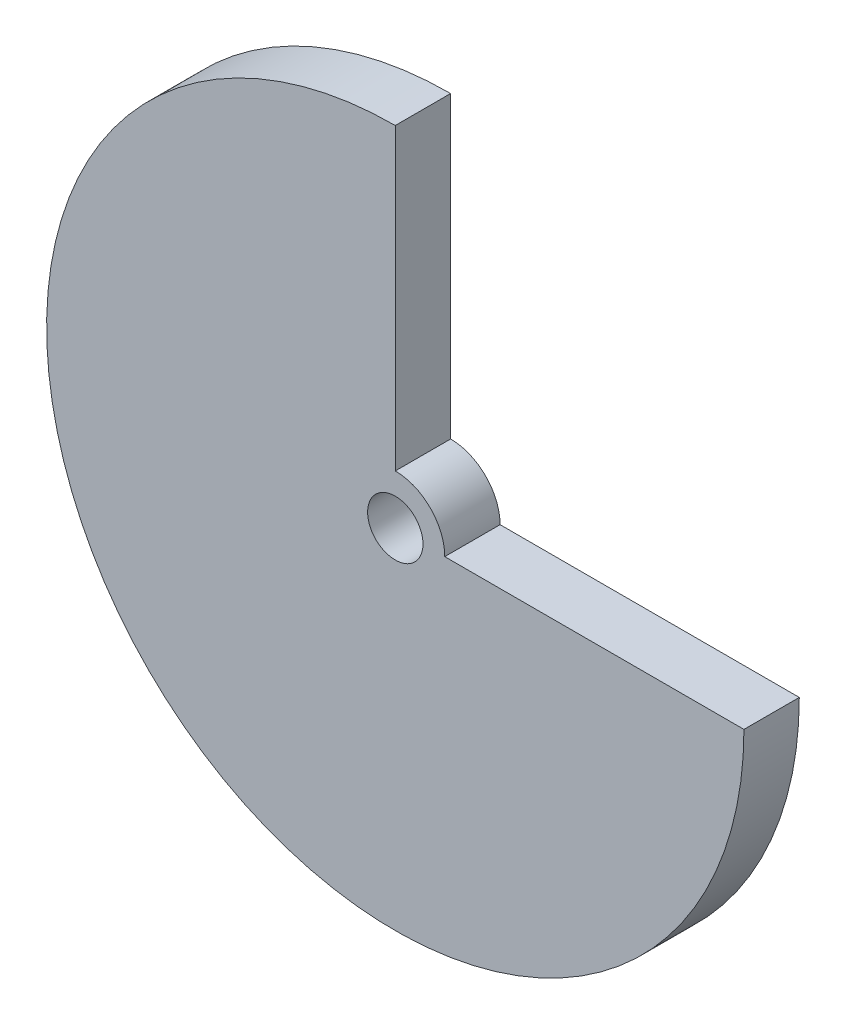
ISO-10303-21;
HEADER;
FILE_DESCRIPTION(('STEP AP214'),'2;1');
FILE_NAME('part.step','',(''),(''),'','','');
FILE_SCHEMA(('AUTOMOTIVE_DESIGN { 1 0 10303 214 1 1 1 1 }'));
ENDSEC;
DATA;
#1=APPLICATION_CONTEXT('core data for automotive mechanical design processes');
#2=APPLICATION_PROTOCOL_DEFINITION('international standard','automotive_design',2000,#1);
#3=PRODUCT_CONTEXT('',#1,'mechanical');
#4=PRODUCT('Part','Part','',(#3));
#5=PRODUCT_RELATED_PRODUCT_CATEGORY('part','',(#4));
#6=PRODUCT_DEFINITION_FORMATION('','',#4);
#7=PRODUCT_DEFINITION_CONTEXT('part definition',#1,'design');
#8=PRODUCT_DEFINITION('design','',#6,#7);
#9=PRODUCT_DEFINITION_SHAPE('','',#8);
#10=(LENGTH_UNIT() NAMED_UNIT(*) SI_UNIT(.MILLI.,.METRE.));
#11=(NAMED_UNIT(*) PLANE_ANGLE_UNIT() SI_UNIT($,.RADIAN.));
#12=(NAMED_UNIT(*) SI_UNIT($,.STERADIAN.) SOLID_ANGLE_UNIT());
#13=UNCERTAINTY_MEASURE_WITH_UNIT(LENGTH_MEASURE(1.E-05),#10,'distance_accuracy_value','');
#14=(GEOMETRIC_REPRESENTATION_CONTEXT(3) GLOBAL_UNCERTAINTY_ASSIGNED_CONTEXT((#13)) GLOBAL_UNIT_ASSIGNED_CONTEXT((#10,
#11,#12)) REPRESENTATION_CONTEXT('',''));
#15=CARTESIAN_POINT('',(0.,0.,0.));
#16=DIRECTION('',(0.,0.,1.));
#17=DIRECTION('',(1.,0.,0.));
#18=AXIS2_PLACEMENT_3D('',#15,#16,#17);
#19=CARTESIAN_POINT('',(0.,0.,6.35));
#20=DIRECTION('',(0.,0.,-1.));
#21=DIRECTION('',(-1.,0.,0.));
#22=AXIS2_PLACEMENT_3D('',#19,#20,#21);
#23=CYLINDRICAL_SURFACE('',#22,5.674999953);
#24=CARTESIAN_POINT('',(0.,0.,0.));
#25=DIRECTION('',(0.,0.,1.));
#26=DIRECTION('',(1.,0.,0.));
#27=AXIS2_PLACEMENT_3D('',#24,#25,#26);
#28=CIRCLE('',#27,5.674999953);
#29=CARTESIAN_POINT('',(5.674999953,0.,0.));
#30=VERTEX_POINT('',#29);
#31=CARTESIAN_POINT('',(0.,5.674999953,0.));
#32=VERTEX_POINT('',#31);
#33=EDGE_CURVE('E95',#30,#32,#28,.T.);
#34=ORIENTED_EDGE('',*,*,#33,.T.);
#35=DIRECTION('',(0.,0.,-1.));
#36=VECTOR('',#35,1.);
#37=CARTESIAN_POINT('',(0.,5.674999953,6.35));
#38=LINE('',#37,#36);
#39=CARTESIAN_POINT('',(0.,5.674999953,6.35));
#40=VERTEX_POINT('',#39);
#41=EDGE_CURVE('E11',#40,#32,#38,.T.);
#42=ORIENTED_EDGE('',*,*,#41,.F.);
#43=CARTESIAN_POINT('',(0.,0.,6.35));
#44=DIRECTION('',(0.,0.,1.));
#45=DIRECTION('',(1.,0.,0.));
#46=AXIS2_PLACEMENT_3D('',#43,#44,#45);
#47=CIRCLE('',#46,5.674999953);
#48=CARTESIAN_POINT('',(5.674999953,0.,6.35));
#49=VERTEX_POINT('',#48);
#50=EDGE_CURVE('E83',#49,#40,#47,.T.);
#51=ORIENTED_EDGE('',*,*,#50,.F.);
#52=DIRECTION('',(0.,0.,-1.));
#53=VECTOR('',#52,1.);
#54=CARTESIAN_POINT('',(5.674999953,0.,6.35));
#55=LINE('',#54,#53);
#56=EDGE_CURVE('E91',#49,#30,#55,.T.);
#57=ORIENTED_EDGE('',*,*,#56,.T.);
#58=EDGE_LOOP('',(#34,#42,#51,#57));
#59=FACE_BOUND('',#58,.T.);
#60=ADVANCED_FACE('F32',(#59),#23,.T.);
#61=CARTESIAN_POINT('',(0.,5.674999953,6.35));
#62=DIRECTION('',(-1.,0.,0.));
#63=DIRECTION('',(0.,0.,1.));
#64=AXIS2_PLACEMENT_3D('',#61,#62,#63);
#65=PLANE('',#64);
#66=DIRECTION('',(0.,1.,0.));
#67=VECTOR('',#66,1.);
#68=CARTESIAN_POINT('',(0.,5.674999953,0.));
#69=LINE('',#68,#67);
#70=CARTESIAN_POINT('',(0.,40.00000001,0.));
#71=VERTEX_POINT('',#70);
#72=EDGE_CURVE('E87',#32,#71,#69,.T.);
#73=ORIENTED_EDGE('',*,*,#72,.T.);
#74=DIRECTION('',(0.,0.,-1.));
#75=VECTOR('',#74,1.);
#76=CARTESIAN_POINT('',(0.,40.00000001,6.35));
#77=LINE('',#76,#75);
#78=CARTESIAN_POINT('',(0.,40.00000001,6.35));
#79=VERTEX_POINT('',#78);
#80=EDGE_CURVE('E40',#79,#71,#77,.T.);
#81=ORIENTED_EDGE('',*,*,#80,.F.);
#82=DIRECTION('',(0.,1.,0.));
#83=VECTOR('',#82,1.);
#84=CARTESIAN_POINT('',(0.,5.674999953,6.35));
#85=LINE('',#84,#83);
#86=EDGE_CURVE('E78',#40,#79,#85,.T.);
#87=ORIENTED_EDGE('',*,*,#86,.F.);
#88=ORIENTED_EDGE('',*,*,#41,.T.);
#89=EDGE_LOOP('',(#73,#81,#87,#88));
#90=FACE_BOUND('',#89,.T.);
#91=ADVANCED_FACE('F86',(#90),#65,.F.);
#92=CARTESIAN_POINT('',(0.,0.,6.35));
#93=DIRECTION('',(0.,0.,-1.));
#94=DIRECTION('',(-1.,0.,0.));
#95=AXIS2_PLACEMENT_3D('',#92,#93,#94);
#96=CYLINDRICAL_SURFACE('',#95,40.00000001);
#97=CARTESIAN_POINT('',(0.,0.,0.));
#98=DIRECTION('',(0.,0.,1.));
#99=DIRECTION('',(1.,0.,0.));
#100=AXIS2_PLACEMENT_3D('',#97,#98,#99);
#101=CIRCLE('',#100,40.00000001);
#102=CARTESIAN_POINT('',(40.00000001,0.,0.));
#103=VERTEX_POINT('',#102);
#104=EDGE_CURVE('E65',#71,#103,#101,.T.);
#105=ORIENTED_EDGE('',*,*,#104,.T.);
#106=DIRECTION('',(0.,0.,-1.));
#107=VECTOR('',#106,1.);
#108=CARTESIAN_POINT('',(40.00000001,0.,6.35));
#109=LINE('',#108,#107);
#110=CARTESIAN_POINT('',(40.00000001,0.,6.35));
#111=VERTEX_POINT('',#110);
#112=EDGE_CURVE('E88',#111,#103,#109,.T.);
#113=ORIENTED_EDGE('',*,*,#112,.F.);
#114=CARTESIAN_POINT('',(0.,0.,6.35));
#115=DIRECTION('',(0.,0.,1.));
#116=DIRECTION('',(1.,0.,0.));
#117=AXIS2_PLACEMENT_3D('',#114,#115,#116);
#118=CIRCLE('',#117,40.00000001);
#119=EDGE_CURVE('E81',#79,#111,#118,.T.);
#120=ORIENTED_EDGE('',*,*,#119,.F.);
#121=ORIENTED_EDGE('',*,*,#80,.T.);
#122=EDGE_LOOP('',(#105,#113,#120,#121));
#123=FACE_BOUND('',#122,.T.);
#124=ADVANCED_FACE('F89',(#123),#96,.T.);
#125=CARTESIAN_POINT('',(5.674999953,0.,6.35));
#126=DIRECTION('',(0.,-1.,0.));
#127=DIRECTION('',(0.,0.,-1.));
#128=AXIS2_PLACEMENT_3D('',#125,#126,#127);
#129=PLANE('',#128);
#130=DIRECTION('',(-1.,0.,0.));
#131=VECTOR('',#130,1.);
#132=CARTESIAN_POINT('',(5.674999953,0.,0.));
#133=LINE('',#132,#131);
#134=EDGE_CURVE('E71',#103,#30,#133,.T.);
#135=ORIENTED_EDGE('',*,*,#134,.T.);
#136=ORIENTED_EDGE('',*,*,#56,.F.);
#137=DIRECTION('',(-1.,0.,0.));
#138=VECTOR('',#137,1.);
#139=CARTESIAN_POINT('',(5.674999953,0.,6.35));
#140=LINE('',#139,#138);
#141=EDGE_CURVE('E48',#111,#49,#140,.T.);
#142=ORIENTED_EDGE('',*,*,#141,.F.);
#143=ORIENTED_EDGE('',*,*,#112,.T.);
#144=EDGE_LOOP('',(#135,#136,#142,#143));
#145=FACE_BOUND('',#144,.T.);
#146=ADVANCED_FACE('F103',(#145),#129,.F.);
#147=CARTESIAN_POINT('',(0.,0.,6.35));
#148=DIRECTION('',(0.,0.,1.));
#149=DIRECTION('',(1.,0.,0.));
#150=AXIS2_PLACEMENT_3D('',#147,#148,#149);
#151=PLANE('',#150);
#152=CARTESIAN_POINT('',(0.,0.,6.35));
#153=DIRECTION('',(0.,0.,1.));
#154=DIRECTION('',(1.,0.,0.));
#155=AXIS2_PLACEMENT_3D('',#152,#153,#154);
#156=CIRCLE('',#155,3.175);
#157=CARTESIAN_POINT('',(3.175,0.,6.35));
#158=VERTEX_POINT('',#157);
#159=EDGE_CURVE('E98',#158,#158,#156,.T.);
#160=ORIENTED_EDGE('',*,*,#159,.F.);
#161=EDGE_LOOP('',(#160));
#162=FACE_BOUND('',#161,.T.);
#163=ORIENTED_EDGE('',*,*,#50,.T.);
#164=ORIENTED_EDGE('',*,*,#86,.T.);
#165=ORIENTED_EDGE('',*,*,#119,.T.);
#166=ORIENTED_EDGE('',*,*,#141,.T.);
#167=EDGE_LOOP('',(#163,#164,#165,#166));
#168=FACE_BOUND('',#167,.T.);
#169=ADVANCED_FACE('F79',(#162,#168),#151,.T.);
#170=CARTESIAN_POINT('',(0.,0.,0.));
#171=DIRECTION('',(0.,0.,1.));
#172=DIRECTION('',(1.,0.,0.));
#173=AXIS2_PLACEMENT_3D('',#170,#171,#172);
#174=PLANE('',#173);
#175=CARTESIAN_POINT('',(0.,0.,0.));
#176=DIRECTION('',(0.,0.,1.));
#177=DIRECTION('',(1.,0.,0.));
#178=AXIS2_PLACEMENT_3D('',#175,#176,#177);
#179=CIRCLE('',#178,3.175);
#180=CARTESIAN_POINT('',(3.175,0.,0.));
#181=VERTEX_POINT('',#180);
#182=EDGE_CURVE('E111',#181,#181,#179,.T.);
#183=ORIENTED_EDGE('',*,*,#182,.T.);
#184=EDGE_LOOP('',(#183));
#185=FACE_BOUND('',#184,.T.);
#186=ORIENTED_EDGE('',*,*,#33,.F.);
#187=ORIENTED_EDGE('',*,*,#134,.F.);
#188=ORIENTED_EDGE('',*,*,#104,.F.);
#189=ORIENTED_EDGE('',*,*,#72,.F.);
#190=EDGE_LOOP('',(#186,#187,#188,#189));
#191=FACE_BOUND('',#190,.T.);
#192=ADVANCED_FACE('F106',(#185,#191),#174,.F.);
#193=CARTESIAN_POINT('',(0.,0.,0.));
#194=DIRECTION('',(0.,0.,1.));
#195=DIRECTION('',(1.,0.,0.));
#196=AXIS2_PLACEMENT_3D('',#193,#194,#195);
#197=CYLINDRICAL_SURFACE('',#196,3.175);
#198=ORIENTED_EDGE('',*,*,#159,.T.);
#199=EDGE_LOOP('',(#198));
#200=FACE_BOUND('',#199,.T.);
#201=ORIENTED_EDGE('',*,*,#182,.F.);
#202=EDGE_LOOP('',(#201));
#203=FACE_BOUND('',#202,.T.);
#204=ADVANCED_FACE('F116',(#200,#203),#197,.F.);
#205=CLOSED_SHELL('',(#60,#91,#124,#146,#169,#192,#204));
#206=MANIFOLD_SOLID_BREP('B2',#205);
#207=ADVANCED_BREP_SHAPE_REPRESENTATION('',(#18,#206),#14);
#208=SHAPE_DEFINITION_REPRESENTATION(#9,#207);
ENDSEC;
END-ISO-10303-21;
